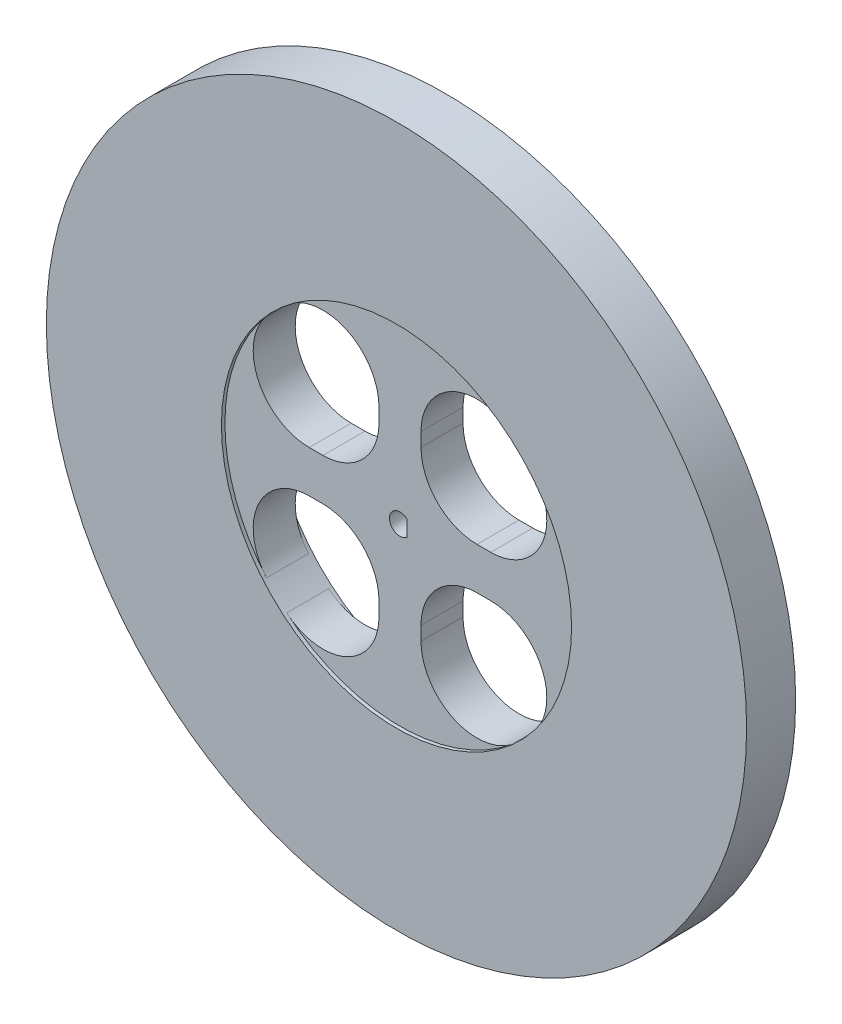
ISO-10303-21;
HEADER;
FILE_DESCRIPTION(('STEP AP214'),'2;1');
FILE_NAME('part.step','',(''),(''),'','','');
FILE_SCHEMA(('AUTOMOTIVE_DESIGN { 1 0 10303 214 1 1 1 1 }'));
ENDSEC;
DATA;
#1=APPLICATION_CONTEXT('core data for automotive mechanical design processes');
#2=APPLICATION_PROTOCOL_DEFINITION('international standard','automotive_design',2000,#1);
#3=PRODUCT_CONTEXT('',#1,'mechanical');
#4=PRODUCT('Part','Part','',(#3));
#5=PRODUCT_RELATED_PRODUCT_CATEGORY('part','',(#4));
#6=PRODUCT_DEFINITION_FORMATION('','',#4);
#7=PRODUCT_DEFINITION_CONTEXT('part definition',#1,'design');
#8=PRODUCT_DEFINITION('design','',#6,#7);
#9=PRODUCT_DEFINITION_SHAPE('','',#8);
#10=(LENGTH_UNIT() NAMED_UNIT(*) SI_UNIT(.MILLI.,.METRE.));
#11=(NAMED_UNIT(*) PLANE_ANGLE_UNIT() SI_UNIT($,.RADIAN.));
#12=(NAMED_UNIT(*) SI_UNIT($,.STERADIAN.) SOLID_ANGLE_UNIT());
#13=UNCERTAINTY_MEASURE_WITH_UNIT(LENGTH_MEASURE(1.E-05),#10,'distance_accuracy_value','');
#14=(GEOMETRIC_REPRESENTATION_CONTEXT(3) GLOBAL_UNCERTAINTY_ASSIGNED_CONTEXT((#13)) GLOBAL_UNIT_ASSIGNED_CONTEXT((#10,
#11,#12)) REPRESENTATION_CONTEXT('',''));
#15=CARTESIAN_POINT('',(0.,0.,0.));
#16=DIRECTION('',(0.,0.,1.));
#17=DIRECTION('',(1.,0.,0.));
#18=AXIS2_PLACEMENT_3D('',#15,#16,#17);
#19=CARTESIAN_POINT('',(0.,0.,-11.6742549493092));
#20=DIRECTION('',(0.,0.,-1.));
#21=DIRECTION('',(-1.,0.,0.));
#22=AXIS2_PLACEMENT_3D('',#19,#20,#21);
#23=CYLINDRICAL_SURFACE('',#22,25.);
#24=CARTESIAN_POINT('',(0.,0.,3.));
#25=DIRECTION('',(0.,0.,1.));
#26=DIRECTION('',(1.,0.,0.));
#27=AXIS2_PLACEMENT_3D('',#24,#25,#26);
#28=CIRCLE('',#27,25.);
#29=CARTESIAN_POINT('',(-19.0610020541408,16.1764705882353,3.));
#30=VERTEX_POINT('',#29);
#31=CARTESIAN_POINT('',(-19.0610020541408,-16.1764705882353,3.));
#32=VERTEX_POINT('',#31);
#33=EDGE_CURVE('E254',#30,#32,#28,.T.);
#34=ORIENTED_EDGE('',*,*,#33,.F.);
#35=DIRECTION('',(0.,0.,-1.));
#36=VECTOR('',#35,1.);
#37=CARTESIAN_POINT('',(-19.0610020541408,16.1764705882353,-11.6742549493092));
#38=LINE('',#37,#36);
#39=CARTESIAN_POINT('',(-19.0610020541408,16.1764705882353,-3.));
#40=VERTEX_POINT('',#39);
#41=EDGE_CURVE('E407',#30,#40,#38,.T.);
#42=ORIENTED_EDGE('',*,*,#41,.T.);
#43=CARTESIAN_POINT('',(0.,0.,-3.));
#44=DIRECTION('',(0.,0.,1.));
#45=DIRECTION('',(1.,0.,0.));
#46=AXIS2_PLACEMENT_3D('',#43,#44,#45);
#47=CIRCLE('',#46,25.);
#48=CARTESIAN_POINT('',(-19.0610020541408,-16.1764705882353,-3.));
#49=VERTEX_POINT('',#48);
#50=EDGE_CURVE('E298',#40,#49,#47,.T.);
#51=ORIENTED_EDGE('',*,*,#50,.T.);
#52=DIRECTION('',(0.,0.,-1.));
#53=VECTOR('',#52,1.);
#54=CARTESIAN_POINT('',(-19.0610020541408,-16.1764705882353,-11.6742549493092));
#55=LINE('',#54,#53);
#56=EDGE_CURVE('E403',#49,#32,#55,.F.);
#57=ORIENTED_EDGE('',*,*,#56,.T.);
#58=EDGE_LOOP('',(#34,#42,#51,#57));
#59=FACE_BOUND('',#58,.T.);
#60=CARTESIAN_POINT('',(0.,0.,3.));
#61=DIRECTION('',(0.,0.,1.));
#62=DIRECTION('',(1.,0.,0.));
#63=AXIS2_PLACEMENT_3D('',#60,#61,#62);
#64=CIRCLE('',#63,25.);
#65=CARTESIAN_POINT('',(19.0610020541408,-16.1764705882353,3.));
#66=VERTEX_POINT('',#65);
#67=CARTESIAN_POINT('',(19.0610020541408,16.1764705882353,3.));
#68=VERTEX_POINT('',#67);
#69=EDGE_CURVE('E276',#66,#68,#64,.T.);
#70=ORIENTED_EDGE('',*,*,#69,.F.);
#71=DIRECTION('',(0.,0.,-1.));
#72=VECTOR('',#71,1.);
#73=CARTESIAN_POINT('',(19.0610020541408,-16.1764705882353,-11.6742549493092));
#74=LINE('',#73,#72);
#75=CARTESIAN_POINT('',(19.0610020541408,-16.1764705882353,-3.));
#76=VERTEX_POINT('',#75);
#77=EDGE_CURVE('E423',#66,#76,#74,.T.);
#78=ORIENTED_EDGE('',*,*,#77,.T.);
#79=CARTESIAN_POINT('',(0.,0.,-3.));
#80=DIRECTION('',(0.,0.,1.));
#81=DIRECTION('',(1.,0.,0.));
#82=AXIS2_PLACEMENT_3D('',#79,#80,#81);
#83=CIRCLE('',#82,25.);
#84=CARTESIAN_POINT('',(19.0610020541408,16.1764705882353,-3.));
#85=VERTEX_POINT('',#84);
#86=EDGE_CURVE('E320',#76,#85,#83,.T.);
#87=ORIENTED_EDGE('',*,*,#86,.T.);
#88=DIRECTION('',(0.,0.,-1.));
#89=VECTOR('',#88,1.);
#90=CARTESIAN_POINT('',(19.0610020541408,16.1764705882353,-11.6742549493092));
#91=LINE('',#90,#89);
#92=EDGE_CURVE('E419',#85,#68,#91,.F.);
#93=ORIENTED_EDGE('',*,*,#92,.T.);
#94=EDGE_LOOP('',(#70,#78,#87,#93));
#95=FACE_BOUND('',#94,.T.);
#96=CARTESIAN_POINT('',(0.,0.,3.5));
#97=DIRECTION('',(0.,0.,-1.));
#98=DIRECTION('',(-1.,0.,0.));
#99=AXIS2_PLACEMENT_3D('',#96,#97,#98);
#100=CIRCLE('',#99,25.);
#101=CARTESIAN_POINT('',(-25.,0.,3.5));
#102=VERTEX_POINT('',#101);
#103=EDGE_CURVE('E339',#102,#102,#100,.T.);
#104=ORIENTED_EDGE('',*,*,#103,.F.);
#105=EDGE_LOOP('',(#104));
#106=FACE_BOUND('',#105,.T.);
#107=CARTESIAN_POINT('',(0.,0.,-3.5));
#108=DIRECTION('',(0.,0.,-1.));
#109=DIRECTION('',(-1.,0.,0.));
#110=AXIS2_PLACEMENT_3D('',#107,#108,#109);
#111=CIRCLE('',#110,25.);
#112=CARTESIAN_POINT('',(-25.,0.,-3.5));
#113=VERTEX_POINT('',#112);
#114=EDGE_CURVE('E335',#113,#113,#111,.T.);
#115=ORIENTED_EDGE('',*,*,#114,.T.);
#116=EDGE_LOOP('',(#115));
#117=FACE_BOUND('',#116,.T.);
#118=DIRECTION('',(0.,0.,-1.));
#119=VECTOR('',#118,1.);
#120=CARTESIAN_POINT('',(-16.1764705882353,19.0610020541408,-11.6742549493092));
#121=LINE('',#120,#119);
#122=CARTESIAN_POINT('',(-16.1764705882353,19.0610020541408,-3.));
#123=VERTEX_POINT('',#122);
#124=CARTESIAN_POINT('',(-16.1764705882353,19.0610020541408,3.));
#125=VERTEX_POINT('',#124);
#126=EDGE_CURVE('E431',#123,#125,#121,.F.);
#127=ORIENTED_EDGE('',*,*,#126,.T.);
#128=CARTESIAN_POINT('',(0.,0.,3.));
#129=DIRECTION('',(0.,0.,1.));
#130=DIRECTION('',(1.,0.,0.));
#131=AXIS2_PLACEMENT_3D('',#128,#129,#130);
#132=CIRCLE('',#131,25.);
#133=CARTESIAN_POINT('',(16.1764705882353,19.0610020541408,3.));
#134=VERTEX_POINT('',#133);
#135=EDGE_CURVE('E230',#134,#125,#132,.T.);
#136=ORIENTED_EDGE('',*,*,#135,.F.);
#137=DIRECTION('',(0.,0.,-1.));
#138=VECTOR('',#137,1.);
#139=CARTESIAN_POINT('',(16.1764705882353,19.0610020541408,-11.6742549493092));
#140=LINE('',#139,#138);
#141=CARTESIAN_POINT('',(16.1764705882353,19.0610020541408,-3.));
#142=VERTEX_POINT('',#141);
#143=EDGE_CURVE('E427',#134,#142,#140,.T.);
#144=ORIENTED_EDGE('',*,*,#143,.T.);
#145=CARTESIAN_POINT('',(0.,0.,-3.));
#146=DIRECTION('',(0.,0.,1.));
#147=DIRECTION('',(1.,0.,0.));
#148=AXIS2_PLACEMENT_3D('',#145,#146,#147);
#149=CIRCLE('',#148,25.);
#150=EDGE_CURVE('E287',#142,#123,#149,.T.);
#151=ORIENTED_EDGE('',*,*,#150,.T.);
#152=EDGE_LOOP('',(#127,#136,#144,#151));
#153=FACE_BOUND('',#152,.T.);
#154=CARTESIAN_POINT('',(0.,0.,3.));
#155=DIRECTION('',(0.,0.,1.));
#156=DIRECTION('',(1.,0.,0.));
#157=AXIS2_PLACEMENT_3D('',#154,#155,#156);
#158=CIRCLE('',#157,25.);
#159=CARTESIAN_POINT('',(-16.1764705882353,-19.0610020541408,3.));
#160=VERTEX_POINT('',#159);
#161=CARTESIAN_POINT('',(16.1764705882353,-19.0610020541408,3.));
#162=VERTEX_POINT('',#161);
#163=EDGE_CURVE('E265',#160,#162,#158,.T.);
#164=ORIENTED_EDGE('',*,*,#163,.F.);
#165=DIRECTION('',(0.,0.,-1.));
#166=VECTOR('',#165,1.);
#167=CARTESIAN_POINT('',(-16.1764705882353,-19.0610020541408,-11.6742549493092));
#168=LINE('',#167,#166);
#169=CARTESIAN_POINT('',(-16.1764705882353,-19.0610020541408,-3.));
#170=VERTEX_POINT('',#169);
#171=EDGE_CURVE('E415',#160,#170,#168,.T.);
#172=ORIENTED_EDGE('',*,*,#171,.T.);
#173=CARTESIAN_POINT('',(0.,0.,-3.));
#174=DIRECTION('',(0.,0.,1.));
#175=DIRECTION('',(1.,0.,0.));
#176=AXIS2_PLACEMENT_3D('',#173,#174,#175);
#177=CIRCLE('',#176,25.);
#178=CARTESIAN_POINT('',(16.1764705882353,-19.0610020541408,-3.));
#179=VERTEX_POINT('',#178);
#180=EDGE_CURVE('E309',#170,#179,#177,.T.);
#181=ORIENTED_EDGE('',*,*,#180,.T.);
#182=DIRECTION('',(0.,0.,-1.));
#183=VECTOR('',#182,1.);
#184=CARTESIAN_POINT('',(16.1764705882353,-19.0610020541408,-11.6742549493092));
#185=LINE('',#184,#183);
#186=EDGE_CURVE('E411',#179,#162,#185,.F.);
#187=ORIENTED_EDGE('',*,*,#186,.T.);
#188=EDGE_LOOP('',(#164,#172,#181,#187));
#189=FACE_BOUND('',#188,.T.);
#190=ADVANCED_FACE('F45',(#59,#95,#106,#117,#153,#189),#23,.F.);
#191=CARTESIAN_POINT('',(0.,0.,-11.6742549493092));
#192=DIRECTION('',(0.,0.,-1.));
#193=DIRECTION('',(-1.,0.,0.));
#194=AXIS2_PLACEMENT_3D('',#191,#192,#193);
#195=CYLINDRICAL_SURFACE('',#194,50.);
#196=CARTESIAN_POINT('',(0.,0.,-3.5));
#197=DIRECTION('',(0.,0.,-1.));
#198=DIRECTION('',(-1.,0.,0.));
#199=AXIS2_PLACEMENT_3D('',#196,#197,#198);
#200=CIRCLE('',#199,50.);
#201=CARTESIAN_POINT('',(-50.,0.,-3.5));
#202=VERTEX_POINT('',#201);
#203=EDGE_CURVE('E331',#202,#202,#200,.T.);
#204=ORIENTED_EDGE('',*,*,#203,.F.);
#205=EDGE_LOOP('',(#204));
#206=FACE_BOUND('',#205,.T.);
#207=CARTESIAN_POINT('',(0.,0.,3.5));
#208=DIRECTION('',(0.,0.,-1.));
#209=DIRECTION('',(-1.,0.,0.));
#210=AXIS2_PLACEMENT_3D('',#207,#208,#209);
#211=CIRCLE('',#210,50.);
#212=CARTESIAN_POINT('',(-50.,0.,3.5));
#213=VERTEX_POINT('',#212);
#214=EDGE_CURVE('E343',#213,#213,#211,.T.);
#215=ORIENTED_EDGE('',*,*,#214,.T.);
#216=EDGE_LOOP('',(#215));
#217=FACE_BOUND('',#216,.T.);
#218=ADVANCED_FACE('F612',(#206,#217),#195,.T.);
#219=CARTESIAN_POINT('',(25.,0.,3.5));
#220=DIRECTION('',(0.,0.,-1.));
#221=DIRECTION('',(-1.,0.,0.));
#222=AXIS2_PLACEMENT_3D('',#219,#220,#221);
#223=PLANE('',#222);
#224=ORIENTED_EDGE('',*,*,#214,.F.);
#225=EDGE_LOOP('',(#224));
#226=FACE_BOUND('',#225,.T.);
#227=ORIENTED_EDGE('',*,*,#103,.T.);
#228=EDGE_LOOP('',(#227));
#229=FACE_BOUND('',#228,.T.);
#230=ADVANCED_FACE('F619',(#226,#229),#223,.F.);
#231=CARTESIAN_POINT('',(25.,0.,-3.5));
#232=DIRECTION('',(0.,0.,1.));
#233=DIRECTION('',(1.,0.,0.));
#234=AXIS2_PLACEMENT_3D('',#231,#232,#233);
#235=PLANE('',#234);
#236=ORIENTED_EDGE('',*,*,#114,.F.);
#237=EDGE_LOOP('',(#236));
#238=FACE_BOUND('',#237,.T.);
#239=ORIENTED_EDGE('',*,*,#203,.T.);
#240=EDGE_LOOP('',(#239));
#241=FACE_BOUND('',#240,.T.);
#242=ADVANCED_FACE('F624',(#238,#241),#235,.F.);
#243=CARTESIAN_POINT('',(3.00000000000001,24.8193472919817,-3.));
#244=DIRECTION('',(1.,0.,0.));
#245=DIRECTION('',(0.,1.,0.));
#246=AXIS2_PLACEMENT_3D('',#243,#244,#245);
#247=PLANE('',#246);
#248=DIRECTION('',(0.,1.,0.));
#249=VECTOR('',#248,1.);
#250=CARTESIAN_POINT('',(3.00000000000001,24.8193472919817,3.));
#251=LINE('',#250,#249);
#252=CARTESIAN_POINT('',(3.,11.,3.));
#253=VERTEX_POINT('',#252);
#254=CARTESIAN_POINT('',(3.,12.9614813968157,3.));
#255=VERTEX_POINT('',#254);
#256=EDGE_CURVE('E283',#253,#255,#251,.T.);
#257=ORIENTED_EDGE('',*,*,#256,.F.);
#258=DIRECTION('',(0.,0.,1.));
#259=VECTOR('',#258,1.);
#260=CARTESIAN_POINT('',(3.,11.,-3.));
#261=LINE('',#260,#259);
#262=CARTESIAN_POINT('',(3.,11.,-3.));
#263=VERTEX_POINT('',#262);
#264=EDGE_CURVE('E400',#253,#263,#261,.F.);
#265=ORIENTED_EDGE('',*,*,#264,.T.);
#266=DIRECTION('',(0.,1.,0.));
#267=VECTOR('',#266,1.);
#268=CARTESIAN_POINT('',(3.00000000000001,24.8193472919817,-3.));
#269=LINE('',#268,#267);
#270=CARTESIAN_POINT('',(3.,12.9614813968157,-3.));
#271=VERTEX_POINT('',#270);
#272=EDGE_CURVE('E327',#263,#271,#269,.T.);
#273=ORIENTED_EDGE('',*,*,#272,.T.);
#274=DIRECTION('',(0.,0.,-1.));
#275=VECTOR('',#274,1.);
#276=CARTESIAN_POINT('',(3.,12.9614813968157,-3.));
#277=LINE('',#276,#275);
#278=EDGE_CURVE('E396',#271,#255,#277,.F.);
#279=ORIENTED_EDGE('',*,*,#278,.T.);
#280=EDGE_LOOP('',(#257,#265,#273,#279));
#281=FACE_BOUND('',#280,.T.);
#282=ADVANCED_FACE('F579',(#281),#247,.T.);
#283=CARTESIAN_POINT('',(3.,3.,-3.));
#284=DIRECTION('',(0.,1.,0.));
#285=DIRECTION('',(-1.,0.,0.));
#286=AXIS2_PLACEMENT_3D('',#283,#284,#285);
#287=PLANE('',#286);
#288=DIRECTION('',(-1.,0.,0.));
#289=VECTOR('',#288,1.);
#290=CARTESIAN_POINT('',(3.,3.,-3.));
#291=LINE('',#290,#289);
#292=CARTESIAN_POINT('',(12.9614813968157,3.,-3.));
#293=VERTEX_POINT('',#292);
#294=CARTESIAN_POINT('',(11.,3.,-3.));
#295=VERTEX_POINT('',#294);
#296=EDGE_CURVE('E323',#293,#295,#291,.T.);
#297=ORIENTED_EDGE('',*,*,#296,.T.);
#298=DIRECTION('',(0.,0.,1.));
#299=VECTOR('',#298,1.);
#300=CARTESIAN_POINT('',(11.,3.,3.));
#301=LINE('',#300,#299);
#302=CARTESIAN_POINT('',(11.,3.,3.));
#303=VERTEX_POINT('',#302);
#304=EDGE_CURVE('E392',#295,#303,#301,.T.);
#305=ORIENTED_EDGE('',*,*,#304,.T.);
#306=DIRECTION('',(-1.,0.,0.));
#307=VECTOR('',#306,1.);
#308=CARTESIAN_POINT('',(3.,3.,3.));
#309=LINE('',#308,#307);
#310=CARTESIAN_POINT('',(12.9614813968157,3.,3.));
#311=VERTEX_POINT('',#310);
#312=EDGE_CURVE('E279',#311,#303,#309,.T.);
#313=ORIENTED_EDGE('',*,*,#312,.F.);
#314=DIRECTION('',(0.,0.,-1.));
#315=VECTOR('',#314,1.);
#316=CARTESIAN_POINT('',(12.9614813968157,3.,-3.));
#317=LINE('',#316,#315);
#318=EDGE_CURVE('E389',#311,#293,#317,.T.);
#319=ORIENTED_EDGE('',*,*,#318,.T.);
#320=EDGE_LOOP('',(#297,#305,#313,#319));
#321=FACE_BOUND('',#320,.T.);
#322=ADVANCED_FACE('F573',(#321),#287,.T.);
#323=CARTESIAN_POINT('',(3.,-3.,-3.));
#324=DIRECTION('',(0.,-1.,0.));
#325=DIRECTION('',(1.,0.,0.));
#326=AXIS2_PLACEMENT_3D('',#323,#324,#325);
#327=PLANE('',#326);
#328=DIRECTION('',(1.,0.,0.));
#329=VECTOR('',#328,1.);
#330=CARTESIAN_POINT('',(3.,-3.,3.));
#331=LINE('',#330,#329);
#332=CARTESIAN_POINT('',(11.,-3.,3.));
#333=VERTEX_POINT('',#332);
#334=CARTESIAN_POINT('',(12.9614813968157,-3.,3.));
#335=VERTEX_POINT('',#334);
#336=EDGE_CURVE('E272',#333,#335,#331,.T.);
#337=ORIENTED_EDGE('',*,*,#336,.F.);
#338=DIRECTION('',(0.,0.,1.));
#339=VECTOR('',#338,1.);
#340=CARTESIAN_POINT('',(11.,-3.,-3.));
#341=LINE('',#340,#339);
#342=CARTESIAN_POINT('',(11.,-3.,-3.));
#343=VERTEX_POINT('',#342);
#344=EDGE_CURVE('E358',#333,#343,#341,.F.);
#345=ORIENTED_EDGE('',*,*,#344,.T.);
#346=DIRECTION('',(1.,0.,0.));
#347=VECTOR('',#346,1.);
#348=CARTESIAN_POINT('',(3.,-3.,-3.));
#349=LINE('',#348,#347);
#350=CARTESIAN_POINT('',(12.9614813968157,-3.,-3.));
#351=VERTEX_POINT('',#350);
#352=EDGE_CURVE('E316',#343,#351,#349,.T.);
#353=ORIENTED_EDGE('',*,*,#352,.T.);
#354=DIRECTION('',(0.,0.,-1.));
#355=VECTOR('',#354,1.);
#356=CARTESIAN_POINT('',(12.9614813968157,-3.,-3.));
#357=LINE('',#356,#355);
#358=EDGE_CURVE('E354',#351,#335,#357,.F.);
#359=ORIENTED_EDGE('',*,*,#358,.T.);
#360=EDGE_LOOP('',(#337,#345,#353,#359));
#361=FACE_BOUND('',#360,.T.);
#362=ADVANCED_FACE('F553',(#361),#327,.T.);
#363=CARTESIAN_POINT('',(3.,-3.,-3.));
#364=DIRECTION('',(1.,0.,0.));
#365=DIRECTION('',(0.,1.,0.));
#366=AXIS2_PLACEMENT_3D('',#363,#364,#365);
#367=PLANE('',#366);
#368=DIRECTION('',(0.,1.,0.));
#369=VECTOR('',#368,1.);
#370=CARTESIAN_POINT('',(3.,-3.,-3.));
#371=LINE('',#370,#369);
#372=CARTESIAN_POINT('',(3.,-12.9614813968157,-3.));
#373=VERTEX_POINT('',#372);
#374=CARTESIAN_POINT('',(3.,-11.,-3.));
#375=VERTEX_POINT('',#374);
#376=EDGE_CURVE('E312',#373,#375,#371,.T.);
#377=ORIENTED_EDGE('',*,*,#376,.T.);
#378=DIRECTION('',(0.,0.,1.));
#379=VECTOR('',#378,1.);
#380=CARTESIAN_POINT('',(3.,-11.,3.));
#381=LINE('',#380,#379);
#382=CARTESIAN_POINT('',(3.,-11.,3.));
#383=VERTEX_POINT('',#382);
#384=EDGE_CURVE('E350',#375,#383,#381,.T.);
#385=ORIENTED_EDGE('',*,*,#384,.T.);
#386=DIRECTION('',(0.,1.,0.));
#387=VECTOR('',#386,1.);
#388=CARTESIAN_POINT('',(3.,-3.,3.));
#389=LINE('',#388,#387);
#390=CARTESIAN_POINT('',(3.,-12.9614813968157,3.));
#391=VERTEX_POINT('',#390);
#392=EDGE_CURVE('E268',#391,#383,#389,.T.);
#393=ORIENTED_EDGE('',*,*,#392,.F.);
#394=DIRECTION('',(0.,0.,-1.));
#395=VECTOR('',#394,1.);
#396=CARTESIAN_POINT('',(3.,-12.9614813968157,-3.));
#397=LINE('',#396,#395);
#398=EDGE_CURVE('E347',#391,#373,#397,.T.);
#399=ORIENTED_EDGE('',*,*,#398,.T.);
#400=EDGE_LOOP('',(#377,#385,#393,#399));
#401=FACE_BOUND('',#400,.T.);
#402=ADVANCED_FACE('F547',(#401),#367,.T.);
#403=CARTESIAN_POINT('',(-3.,-3.,-3.));
#404=DIRECTION('',(-1.,0.,0.));
#405=DIRECTION('',(0.,-1.,0.));
#406=AXIS2_PLACEMENT_3D('',#403,#404,#405);
#407=PLANE('',#406);
#408=DIRECTION('',(0.,-1.,0.));
#409=VECTOR('',#408,1.);
#410=CARTESIAN_POINT('',(-3.,-3.,3.));
#411=LINE('',#410,#409);
#412=CARTESIAN_POINT('',(-3.,-11.,3.));
#413=VERTEX_POINT('',#412);
#414=CARTESIAN_POINT('',(-3.,-12.9614813968157,3.));
#415=VERTEX_POINT('',#414);
#416=EDGE_CURVE('E261',#413,#415,#411,.T.);
#417=ORIENTED_EDGE('',*,*,#416,.F.);
#418=DIRECTION('',(0.,0.,1.));
#419=VECTOR('',#418,1.);
#420=CARTESIAN_POINT('',(-3.,-11.,-3.));
#421=LINE('',#420,#419);
#422=CARTESIAN_POINT('',(-3.,-11.,-3.));
#423=VERTEX_POINT('',#422);
#424=EDGE_CURVE('E372',#413,#423,#421,.F.);
#425=ORIENTED_EDGE('',*,*,#424,.T.);
#426=DIRECTION('',(0.,-1.,0.));
#427=VECTOR('',#426,1.);
#428=CARTESIAN_POINT('',(-3.,-3.,-3.));
#429=LINE('',#428,#427);
#430=CARTESIAN_POINT('',(-3.,-12.9614813968157,-3.));
#431=VERTEX_POINT('',#430);
#432=EDGE_CURVE('E305',#423,#431,#429,.T.);
#433=ORIENTED_EDGE('',*,*,#432,.T.);
#434=DIRECTION('',(0.,0.,-1.));
#435=VECTOR('',#434,1.);
#436=CARTESIAN_POINT('',(-3.,-12.9614813968157,-3.));
#437=LINE('',#436,#435);
#438=EDGE_CURVE('E368',#431,#415,#437,.F.);
#439=ORIENTED_EDGE('',*,*,#438,.T.);
#440=EDGE_LOOP('',(#417,#425,#433,#439));
#441=FACE_BOUND('',#440,.T.);
#442=ADVANCED_FACE('F528',(#441),#407,.T.);
#443=CARTESIAN_POINT('',(-24.8193472919817,-3.,-3.));
#444=DIRECTION('',(0.,-1.,0.));
#445=DIRECTION('',(1.,0.,0.));
#446=AXIS2_PLACEMENT_3D('',#443,#444,#445);
#447=PLANE('',#446);
#448=DIRECTION('',(1.,0.,0.));
#449=VECTOR('',#448,1.);
#450=CARTESIAN_POINT('',(-24.8193472919817,-3.,-3.));
#451=LINE('',#450,#449);
#452=CARTESIAN_POINT('',(-12.9614813968157,-3.,-3.));
#453=VERTEX_POINT('',#452);
#454=CARTESIAN_POINT('',(-11.,-3.,-3.));
#455=VERTEX_POINT('',#454);
#456=EDGE_CURVE('E301',#453,#455,#451,.T.);
#457=ORIENTED_EDGE('',*,*,#456,.T.);
#458=DIRECTION('',(0.,0.,1.));
#459=VECTOR('',#458,1.);
#460=CARTESIAN_POINT('',(-11.,-3.,3.));
#461=LINE('',#460,#459);
#462=CARTESIAN_POINT('',(-11.,-3.,3.));
#463=VERTEX_POINT('',#462);
#464=EDGE_CURVE('E364',#455,#463,#461,.T.);
#465=ORIENTED_EDGE('',*,*,#464,.T.);
#466=DIRECTION('',(1.,0.,0.));
#467=VECTOR('',#466,1.);
#468=CARTESIAN_POINT('',(-24.8193472919817,-3.,3.));
#469=LINE('',#468,#467);
#470=CARTESIAN_POINT('',(-12.9614813968157,-3.,3.));
#471=VERTEX_POINT('',#470);
#472=EDGE_CURVE('E257',#471,#463,#469,.T.);
#473=ORIENTED_EDGE('',*,*,#472,.F.);
#474=DIRECTION('',(0.,0.,-1.));
#475=VECTOR('',#474,1.);
#476=CARTESIAN_POINT('',(-12.9614813968157,-3.,-3.));
#477=LINE('',#476,#475);
#478=EDGE_CURVE('E361',#471,#453,#477,.T.);
#479=ORIENTED_EDGE('',*,*,#478,.T.);
#480=EDGE_LOOP('',(#457,#465,#473,#479));
#481=FACE_BOUND('',#480,.T.);
#482=ADVANCED_FACE('F517',(#481),#447,.T.);
#483=CARTESIAN_POINT('',(-24.8193472919817,3.,-3.));
#484=DIRECTION('',(0.,1.,0.));
#485=DIRECTION('',(-1.,0.,0.));
#486=AXIS2_PLACEMENT_3D('',#483,#484,#485);
#487=PLANE('',#486);
#488=DIRECTION('',(-1.,0.,0.));
#489=VECTOR('',#488,1.);
#490=CARTESIAN_POINT('',(-24.8193472919817,3.,3.));
#491=LINE('',#490,#489);
#492=CARTESIAN_POINT('',(-11.,3.,3.));
#493=VERTEX_POINT('',#492);
#494=CARTESIAN_POINT('',(-12.9614813968157,3.,3.));
#495=VERTEX_POINT('',#494);
#496=EDGE_CURVE('E250',#493,#495,#491,.T.);
#497=ORIENTED_EDGE('',*,*,#496,.F.);
#498=DIRECTION('',(0.,0.,1.));
#499=VECTOR('',#498,1.);
#500=CARTESIAN_POINT('',(-11.,3.,-3.));
#501=LINE('',#500,#499);
#502=CARTESIAN_POINT('',(-11.,3.,-3.));
#503=VERTEX_POINT('',#502);
#504=EDGE_CURVE('E386',#493,#503,#501,.F.);
#505=ORIENTED_EDGE('',*,*,#504,.T.);
#506=DIRECTION('',(-1.,0.,0.));
#507=VECTOR('',#506,1.);
#508=CARTESIAN_POINT('',(-24.8193472919817,3.,-3.));
#509=LINE('',#508,#507);
#510=CARTESIAN_POINT('',(-12.9614813968157,3.,-3.));
#511=VERTEX_POINT('',#510);
#512=EDGE_CURVE('E294',#503,#511,#509,.T.);
#513=ORIENTED_EDGE('',*,*,#512,.T.);
#514=DIRECTION('',(0.,0.,-1.));
#515=VECTOR('',#514,1.);
#516=CARTESIAN_POINT('',(-12.9614813968157,3.,-3.));
#517=LINE('',#516,#515);
#518=EDGE_CURVE('E382',#511,#495,#517,.F.);
#519=ORIENTED_EDGE('',*,*,#518,.T.);
#520=EDGE_LOOP('',(#497,#505,#513,#519));
#521=FACE_BOUND('',#520,.T.);
#522=ADVANCED_FACE('F604',(#521),#487,.T.);
#523=CARTESIAN_POINT('',(-2.99999999999999,24.8193472919817,-3.));
#524=DIRECTION('',(-1.,0.,0.));
#525=DIRECTION('',(0.,-1.,0.));
#526=AXIS2_PLACEMENT_3D('',#523,#524,#525);
#527=PLANE('',#526);
#528=DIRECTION('',(0.,-1.,0.));
#529=VECTOR('',#528,1.);
#530=CARTESIAN_POINT('',(-2.99999999999999,24.8193472919817,-3.));
#531=LINE('',#530,#529);
#532=CARTESIAN_POINT('',(-3.,12.9614813968157,-3.));
#533=VERTEX_POINT('',#532);
#534=CARTESIAN_POINT('',(-3.,11.,-3.));
#535=VERTEX_POINT('',#534);
#536=EDGE_CURVE('E290',#533,#535,#531,.T.);
#537=ORIENTED_EDGE('',*,*,#536,.T.);
#538=DIRECTION('',(0.,0.,1.));
#539=VECTOR('',#538,1.);
#540=CARTESIAN_POINT('',(-3.,11.,3.));
#541=LINE('',#540,#539);
#542=CARTESIAN_POINT('',(-3.,11.,3.));
#543=VERTEX_POINT('',#542);
#544=EDGE_CURVE('E378',#535,#543,#541,.T.);
#545=ORIENTED_EDGE('',*,*,#544,.T.);
#546=DIRECTION('',(0.,-1.,0.));
#547=VECTOR('',#546,1.);
#548=CARTESIAN_POINT('',(-2.99999999999999,24.8193472919817,3.));
#549=LINE('',#548,#547);
#550=CARTESIAN_POINT('',(-3.,12.9614813968157,3.));
#551=VERTEX_POINT('',#550);
#552=EDGE_CURVE('E246',#551,#543,#549,.T.);
#553=ORIENTED_EDGE('',*,*,#552,.F.);
#554=DIRECTION('',(0.,0.,-1.));
#555=VECTOR('',#554,1.);
#556=CARTESIAN_POINT('',(-3.,12.9614813968157,-3.));
#557=LINE('',#556,#555);
#558=EDGE_CURVE('E375',#551,#533,#557,.T.);
#559=ORIENTED_EDGE('',*,*,#558,.T.);
#560=EDGE_LOOP('',(#537,#545,#553,#559));
#561=FACE_BOUND('',#560,.T.);
#562=ADVANCED_FACE('F598',(#561),#527,.T.);
#563=CARTESIAN_POINT('',(0.,0.,-3.));
#564=DIRECTION('',(0.,0.,1.));
#565=DIRECTION('',(1.,0.,0.));
#566=AXIS2_PLACEMENT_3D('',#563,#564,#565);
#567=PLANE('',#566);
#568=DIRECTION('',(0.,-1.,0.));
#569=VECTOR('',#568,1.);
#570=CARTESIAN_POINT('',(1.,1.11803398874989,-3.));
#571=LINE('',#570,#569);
#572=CARTESIAN_POINT('',(1.,1.11803398874989,-3.));
#573=VERTEX_POINT('',#572);
#574=CARTESIAN_POINT('',(1.,-1.11803398874989,-3.));
#575=VERTEX_POINT('',#574);
#576=EDGE_CURVE('E226',#573,#575,#571,.T.);
#577=ORIENTED_EDGE('',*,*,#576,.F.);
#578=CARTESIAN_POINT('',(0.,0.,-3.));
#579=DIRECTION('',(0.,0.,1.));
#580=DIRECTION('',(1.,0.,0.));
#581=AXIS2_PLACEMENT_3D('',#578,#579,#580);
#582=CIRCLE('',#581,1.5);
#583=EDGE_CURVE('E61',#575,#573,#582,.F.);
#584=ORIENTED_EDGE('',*,*,#583,.F.);
#585=EDGE_LOOP('',(#577,#584));
#586=FACE_BOUND('',#585,.T.);
#587=ORIENTED_EDGE('',*,*,#150,.F.);
#588=CARTESIAN_POINT('',(11.,12.9614813968157,-3.));
#589=DIRECTION('',(0.,0.,1.));
#590=DIRECTION('',(1.,0.,0.));
#591=AXIS2_PLACEMENT_3D('',#588,#589,#590);
#592=CIRCLE('',#591,8.);
#593=EDGE_CURVE('E470',#142,#271,#592,.T.);
#594=ORIENTED_EDGE('',*,*,#593,.T.);
#595=ORIENTED_EDGE('',*,*,#272,.F.);
#596=CARTESIAN_POINT('',(11.,11.,-3.));
#597=DIRECTION('',(0.,0.,1.));
#598=DIRECTION('',(1.,0.,0.));
#599=AXIS2_PLACEMENT_3D('',#596,#597,#598);
#600=CIRCLE('',#599,8.);
#601=EDGE_CURVE('E456',#263,#295,#600,.T.);
#602=ORIENTED_EDGE('',*,*,#601,.T.);
#603=ORIENTED_EDGE('',*,*,#296,.F.);
#604=CARTESIAN_POINT('',(12.9614813968157,11.,-3.));
#605=DIRECTION('',(0.,0.,1.));
#606=DIRECTION('',(1.,0.,0.));
#607=AXIS2_PLACEMENT_3D('',#604,#605,#606);
#608=CIRCLE('',#607,8.);
#609=EDGE_CURVE('E483',#293,#85,#608,.T.);
#610=ORIENTED_EDGE('',*,*,#609,.T.);
#611=ORIENTED_EDGE('',*,*,#86,.F.);
#612=CARTESIAN_POINT('',(12.9614813968157,-11.,-3.));
#613=DIRECTION('',(0.,0.,1.));
#614=DIRECTION('',(1.,0.,0.));
#615=AXIS2_PLACEMENT_3D('',#612,#613,#614);
#616=CIRCLE('',#615,8.);
#617=EDGE_CURVE('E477',#76,#351,#616,.T.);
#618=ORIENTED_EDGE('',*,*,#617,.T.);
#619=ORIENTED_EDGE('',*,*,#352,.F.);
#620=CARTESIAN_POINT('',(11.,-11.,-3.));
#621=DIRECTION('',(0.,0.,1.));
#622=DIRECTION('',(1.,0.,0.));
#623=AXIS2_PLACEMENT_3D('',#620,#621,#622);
#624=CIRCLE('',#623,8.);
#625=EDGE_CURVE('E438',#343,#375,#624,.T.);
#626=ORIENTED_EDGE('',*,*,#625,.T.);
#627=ORIENTED_EDGE('',*,*,#376,.F.);
#628=CARTESIAN_POINT('',(11.,-12.9614813968157,-3.));
#629=DIRECTION('',(0.,0.,1.));
#630=DIRECTION('',(1.,0.,0.));
#631=AXIS2_PLACEMENT_3D('',#628,#629,#630);
#632=CIRCLE('',#631,8.);
#633=EDGE_CURVE('E497',#373,#179,#632,.T.);
#634=ORIENTED_EDGE('',*,*,#633,.T.);
#635=ORIENTED_EDGE('',*,*,#180,.F.);
#636=CARTESIAN_POINT('',(-11.,-12.9614813968157,-3.));
#637=DIRECTION('',(0.,0.,1.));
#638=DIRECTION('',(1.,0.,0.));
#639=AXIS2_PLACEMENT_3D('',#636,#637,#638);
#640=CIRCLE('',#639,8.);
#641=EDGE_CURVE('E491',#170,#431,#640,.T.);
#642=ORIENTED_EDGE('',*,*,#641,.T.);
#643=ORIENTED_EDGE('',*,*,#432,.F.);
#644=CARTESIAN_POINT('',(-11.,-11.,-3.));
#645=DIRECTION('',(0.,0.,1.));
#646=DIRECTION('',(1.,0.,0.));
#647=AXIS2_PLACEMENT_3D('',#644,#645,#646);
#648=CIRCLE('',#647,8.);
#649=EDGE_CURVE('E444',#423,#455,#648,.T.);
#650=ORIENTED_EDGE('',*,*,#649,.T.);
#651=ORIENTED_EDGE('',*,*,#456,.F.);
#652=CARTESIAN_POINT('',(-12.9614813968157,-11.,-3.));
#653=DIRECTION('',(0.,0.,1.));
#654=DIRECTION('',(1.,0.,0.));
#655=AXIS2_PLACEMENT_3D('',#652,#653,#654);
#656=CIRCLE('',#655,8.);
#657=EDGE_CURVE('E11',#453,#49,#656,.T.);
#658=ORIENTED_EDGE('',*,*,#657,.T.);
#659=ORIENTED_EDGE('',*,*,#50,.F.);
#660=CARTESIAN_POINT('',(-12.9614813968157,11.,-3.));
#661=DIRECTION('',(0.,0.,1.));
#662=DIRECTION('',(1.,0.,0.));
#663=AXIS2_PLACEMENT_3D('',#660,#661,#662);
#664=CIRCLE('',#663,8.);
#665=EDGE_CURVE('E505',#40,#511,#664,.T.);
#666=ORIENTED_EDGE('',*,*,#665,.T.);
#667=ORIENTED_EDGE('',*,*,#512,.F.);
#668=CARTESIAN_POINT('',(-11.,11.,-3.));
#669=DIRECTION('',(0.,0.,1.));
#670=DIRECTION('',(1.,0.,0.));
#671=AXIS2_PLACEMENT_3D('',#668,#669,#670);
#672=CIRCLE('',#671,8.);
#673=EDGE_CURVE('E450',#503,#535,#672,.T.);
#674=ORIENTED_EDGE('',*,*,#673,.T.);
#675=ORIENTED_EDGE('',*,*,#536,.F.);
#676=CARTESIAN_POINT('',(-11.,12.9614813968157,-3.));
#677=DIRECTION('',(0.,0.,1.));
#678=DIRECTION('',(1.,0.,0.));
#679=AXIS2_PLACEMENT_3D('',#676,#677,#678);
#680=CIRCLE('',#679,8.);
#681=EDGE_CURVE('E462',#533,#123,#680,.T.);
#682=ORIENTED_EDGE('',*,*,#681,.T.);
#683=EDGE_LOOP('',(#587,#594,#595,#602,#603,#610,#611,#618,#619,#626,#627,#634,#635,#642,#643,
#650,#651,#658,#659,#666,#667,#674,#675,#682));
#684=FACE_BOUND('',#683,.T.);
#685=ADVANCED_FACE('F232',(#586,#684),#567,.F.);
#686=CARTESIAN_POINT('',(0.,0.,3.));
#687=DIRECTION('',(0.,0.,1.));
#688=DIRECTION('',(1.,0.,0.));
#689=AXIS2_PLACEMENT_3D('',#686,#687,#688);
#690=PLANE('',#689);
#691=CARTESIAN_POINT('',(0.,0.,3.));
#692=DIRECTION('',(0.,0.,1.));
#693=DIRECTION('',(1.,0.,0.));
#694=AXIS2_PLACEMENT_3D('',#691,#692,#693);
#695=CIRCLE('',#694,1.5);
#696=CARTESIAN_POINT('',(1.,1.11803398874989,3.));
#697=VERTEX_POINT('',#696);
#698=CARTESIAN_POINT('',(1.,-1.11803398874989,3.));
#699=VERTEX_POINT('',#698);
#700=EDGE_CURVE('E66',#697,#699,#695,.T.);
#701=ORIENTED_EDGE('',*,*,#700,.F.);
#702=DIRECTION('',(0.,1.,0.));
#703=VECTOR('',#702,1.);
#704=CARTESIAN_POINT('',(1.,1.11803398874989,3.));
#705=LINE('',#704,#703);
#706=EDGE_CURVE('E223',#699,#697,#705,.T.);
#707=ORIENTED_EDGE('',*,*,#706,.F.);
#708=EDGE_LOOP('',(#701,#707));
#709=FACE_BOUND('',#708,.T.);
#710=ORIENTED_EDGE('',*,*,#135,.T.);
#711=CARTESIAN_POINT('',(-11.,12.9614813968157,3.));
#712=DIRECTION('',(0.,0.,1.));
#713=DIRECTION('',(1.,0.,0.));
#714=AXIS2_PLACEMENT_3D('',#711,#712,#713);
#715=CIRCLE('',#714,8.);
#716=EDGE_CURVE('E459',#125,#551,#715,.F.);
#717=ORIENTED_EDGE('',*,*,#716,.T.);
#718=ORIENTED_EDGE('',*,*,#552,.T.);
#719=CARTESIAN_POINT('',(-11.,11.,3.));
#720=DIRECTION('',(0.,0.,1.));
#721=DIRECTION('',(1.,0.,0.));
#722=AXIS2_PLACEMENT_3D('',#719,#720,#721);
#723=CIRCLE('',#722,8.);
#724=EDGE_CURVE('E447',#543,#493,#723,.F.);
#725=ORIENTED_EDGE('',*,*,#724,.T.);
#726=ORIENTED_EDGE('',*,*,#496,.T.);
#727=CARTESIAN_POINT('',(-12.9614813968157,11.,3.));
#728=DIRECTION('',(0.,0.,1.));
#729=DIRECTION('',(1.,0.,0.));
#730=AXIS2_PLACEMENT_3D('',#727,#728,#729);
#731=CIRCLE('',#730,8.);
#732=EDGE_CURVE('E501',#495,#30,#731,.F.);
#733=ORIENTED_EDGE('',*,*,#732,.T.);
#734=ORIENTED_EDGE('',*,*,#33,.T.);
#735=CARTESIAN_POINT('',(-12.9614813968157,-11.,3.));
#736=DIRECTION('',(0.,0.,1.));
#737=DIRECTION('',(1.,0.,0.));
#738=AXIS2_PLACEMENT_3D('',#735,#736,#737);
#739=CIRCLE('',#738,8.);
#740=EDGE_CURVE('E54',#32,#471,#739,.F.);
#741=ORIENTED_EDGE('',*,*,#740,.T.);
#742=ORIENTED_EDGE('',*,*,#472,.T.);
#743=CARTESIAN_POINT('',(-11.,-11.,3.));
#744=DIRECTION('',(0.,0.,1.));
#745=DIRECTION('',(1.,0.,0.));
#746=AXIS2_PLACEMENT_3D('',#743,#744,#745);
#747=CIRCLE('',#746,8.);
#748=EDGE_CURVE('E441',#463,#413,#747,.F.);
#749=ORIENTED_EDGE('',*,*,#748,.T.);
#750=ORIENTED_EDGE('',*,*,#416,.T.);
#751=CARTESIAN_POINT('',(-11.,-12.9614813968157,3.));
#752=DIRECTION('',(0.,0.,1.));
#753=DIRECTION('',(1.,0.,0.));
#754=AXIS2_PLACEMENT_3D('',#751,#752,#753);
#755=CIRCLE('',#754,8.);
#756=EDGE_CURVE('E487',#415,#160,#755,.F.);
#757=ORIENTED_EDGE('',*,*,#756,.T.);
#758=ORIENTED_EDGE('',*,*,#163,.T.);
#759=CARTESIAN_POINT('',(11.,-12.9614813968157,3.));
#760=DIRECTION('',(0.,0.,1.));
#761=DIRECTION('',(1.,0.,0.));
#762=AXIS2_PLACEMENT_3D('',#759,#760,#761);
#763=CIRCLE('',#762,8.);
#764=EDGE_CURVE('E494',#162,#391,#763,.F.);
#765=ORIENTED_EDGE('',*,*,#764,.T.);
#766=ORIENTED_EDGE('',*,*,#392,.T.);
#767=CARTESIAN_POINT('',(11.,-11.,3.));
#768=DIRECTION('',(0.,0.,1.));
#769=DIRECTION('',(1.,0.,0.));
#770=AXIS2_PLACEMENT_3D('',#767,#768,#769);
#771=CIRCLE('',#770,8.);
#772=EDGE_CURVE('E435',#383,#333,#771,.F.);
#773=ORIENTED_EDGE('',*,*,#772,.T.);
#774=ORIENTED_EDGE('',*,*,#336,.T.);
#775=CARTESIAN_POINT('',(12.9614813968157,-11.,3.));
#776=DIRECTION('',(0.,0.,1.));
#777=DIRECTION('',(1.,0.,0.));
#778=AXIS2_PLACEMENT_3D('',#775,#776,#777);
#779=CIRCLE('',#778,8.);
#780=EDGE_CURVE('E473',#335,#66,#779,.F.);
#781=ORIENTED_EDGE('',*,*,#780,.T.);
#782=ORIENTED_EDGE('',*,*,#69,.T.);
#783=CARTESIAN_POINT('',(12.9614813968157,11.,3.));
#784=DIRECTION('',(0.,0.,1.));
#785=DIRECTION('',(1.,0.,0.));
#786=AXIS2_PLACEMENT_3D('',#783,#784,#785);
#787=CIRCLE('',#786,8.);
#788=EDGE_CURVE('E480',#68,#311,#787,.F.);
#789=ORIENTED_EDGE('',*,*,#788,.T.);
#790=ORIENTED_EDGE('',*,*,#312,.T.);
#791=CARTESIAN_POINT('',(11.,11.,3.));
#792=DIRECTION('',(0.,0.,1.));
#793=DIRECTION('',(1.,0.,0.));
#794=AXIS2_PLACEMENT_3D('',#791,#792,#793);
#795=CIRCLE('',#794,8.);
#796=EDGE_CURVE('E453',#303,#253,#795,.F.);
#797=ORIENTED_EDGE('',*,*,#796,.T.);
#798=ORIENTED_EDGE('',*,*,#256,.T.);
#799=CARTESIAN_POINT('',(11.,12.9614813968157,3.));
#800=DIRECTION('',(0.,0.,1.));
#801=DIRECTION('',(1.,0.,0.));
#802=AXIS2_PLACEMENT_3D('',#799,#800,#801);
#803=CIRCLE('',#802,8.);
#804=EDGE_CURVE('E466',#255,#134,#803,.F.);
#805=ORIENTED_EDGE('',*,*,#804,.T.);
#806=EDGE_LOOP('',(#710,#717,#718,#725,#726,#733,#734,#741,#742,#749,#750,#757,#758,#765,#766,
#773,#774,#781,#782,#789,#790,#797,#798,#805));
#807=FACE_BOUND('',#806,.T.);
#808=ADVANCED_FACE('F512',(#709,#807),#690,.T.);
#809=CARTESIAN_POINT('',(11.,-11.,-3.));
#810=DIRECTION('',(0.,0.,-1.));
#811=DIRECTION('',(-1.,0.,0.));
#812=AXIS2_PLACEMENT_3D('',#809,#810,#811);
#813=CYLINDRICAL_SURFACE('',#812,8.);
#814=ORIENTED_EDGE('',*,*,#625,.F.);
#815=ORIENTED_EDGE('',*,*,#344,.F.);
#816=ORIENTED_EDGE('',*,*,#772,.F.);
#817=ORIENTED_EDGE('',*,*,#384,.F.);
#818=EDGE_LOOP('',(#814,#815,#816,#817));
#819=FACE_BOUND('',#818,.T.);
#820=ADVANCED_FACE('F549',(#819),#813,.F.);
#821=CARTESIAN_POINT('',(-11.,-11.,-3.));
#822=DIRECTION('',(0.,0.,-1.));
#823=DIRECTION('',(-1.,0.,0.));
#824=AXIS2_PLACEMENT_3D('',#821,#822,#823);
#825=CYLINDRICAL_SURFACE('',#824,8.);
#826=ORIENTED_EDGE('',*,*,#649,.F.);
#827=ORIENTED_EDGE('',*,*,#424,.F.);
#828=ORIENTED_EDGE('',*,*,#748,.F.);
#829=ORIENTED_EDGE('',*,*,#464,.F.);
#830=EDGE_LOOP('',(#826,#827,#828,#829));
#831=FACE_BOUND('',#830,.T.);
#832=ADVANCED_FACE('F524',(#831),#825,.F.);
#833=CARTESIAN_POINT('',(-11.,11.,-3.));
#834=DIRECTION('',(0.,0.,-1.));
#835=DIRECTION('',(-1.,0.,0.));
#836=AXIS2_PLACEMENT_3D('',#833,#834,#835);
#837=CYLINDRICAL_SURFACE('',#836,8.);
#838=ORIENTED_EDGE('',*,*,#673,.F.);
#839=ORIENTED_EDGE('',*,*,#504,.F.);
#840=ORIENTED_EDGE('',*,*,#724,.F.);
#841=ORIENTED_EDGE('',*,*,#544,.F.);
#842=EDGE_LOOP('',(#838,#839,#840,#841));
#843=FACE_BOUND('',#842,.T.);
#844=ADVANCED_FACE('F600',(#843),#837,.F.);
#845=CARTESIAN_POINT('',(11.,11.,-3.));
#846=DIRECTION('',(0.,0.,-1.));
#847=DIRECTION('',(-1.,0.,0.));
#848=AXIS2_PLACEMENT_3D('',#845,#846,#847);
#849=CYLINDRICAL_SURFACE('',#848,8.);
#850=ORIENTED_EDGE('',*,*,#601,.F.);
#851=ORIENTED_EDGE('',*,*,#264,.F.);
#852=ORIENTED_EDGE('',*,*,#796,.F.);
#853=ORIENTED_EDGE('',*,*,#304,.F.);
#854=EDGE_LOOP('',(#850,#851,#852,#853));
#855=FACE_BOUND('',#854,.T.);
#856=ADVANCED_FACE('F575',(#855),#849,.F.);
#857=CARTESIAN_POINT('',(-11.,12.9614813968157,-11.6742549493092));
#858=DIRECTION('',(0.,0.,-1.));
#859=DIRECTION('',(-1.,0.,0.));
#860=AXIS2_PLACEMENT_3D('',#857,#858,#859);
#861=CYLINDRICAL_SURFACE('',#860,8.);
#862=ORIENTED_EDGE('',*,*,#681,.F.);
#863=ORIENTED_EDGE('',*,*,#558,.F.);
#864=ORIENTED_EDGE('',*,*,#716,.F.);
#865=ORIENTED_EDGE('',*,*,#126,.F.);
#866=EDGE_LOOP('',(#862,#863,#864,#865));
#867=FACE_BOUND('',#866,.T.);
#868=ADVANCED_FACE('F592',(#867),#861,.F.);
#869=CARTESIAN_POINT('',(11.,12.9614813968157,-11.6742549493092));
#870=DIRECTION('',(0.,0.,-1.));
#871=DIRECTION('',(-1.,0.,0.));
#872=AXIS2_PLACEMENT_3D('',#869,#870,#871);
#873=CYLINDRICAL_SURFACE('',#872,8.);
#874=ORIENTED_EDGE('',*,*,#593,.F.);
#875=ORIENTED_EDGE('',*,*,#143,.F.);
#876=ORIENTED_EDGE('',*,*,#804,.F.);
#877=ORIENTED_EDGE('',*,*,#278,.F.);
#878=EDGE_LOOP('',(#874,#875,#876,#877));
#879=FACE_BOUND('',#878,.T.);
#880=ADVANCED_FACE('F583',(#879),#873,.F.);
#881=CARTESIAN_POINT('',(12.9614813968157,-11.,-11.6742549493092));
#882=DIRECTION('',(0.,0.,-1.));
#883=DIRECTION('',(-1.,0.,0.));
#884=AXIS2_PLACEMENT_3D('',#881,#882,#883);
#885=CYLINDRICAL_SURFACE('',#884,8.);
#886=ORIENTED_EDGE('',*,*,#617,.F.);
#887=ORIENTED_EDGE('',*,*,#77,.F.);
#888=ORIENTED_EDGE('',*,*,#780,.F.);
#889=ORIENTED_EDGE('',*,*,#358,.F.);
#890=EDGE_LOOP('',(#886,#887,#888,#889));
#891=FACE_BOUND('',#890,.T.);
#892=ADVANCED_FACE('F557',(#891),#885,.F.);
#893=CARTESIAN_POINT('',(12.9614813968157,11.,-11.6742549493092));
#894=DIRECTION('',(0.,0.,-1.));
#895=DIRECTION('',(-1.,0.,0.));
#896=AXIS2_PLACEMENT_3D('',#893,#894,#895);
#897=CYLINDRICAL_SURFACE('',#896,8.);
#898=ORIENTED_EDGE('',*,*,#609,.F.);
#899=ORIENTED_EDGE('',*,*,#318,.F.);
#900=ORIENTED_EDGE('',*,*,#788,.F.);
#901=ORIENTED_EDGE('',*,*,#92,.F.);
#902=EDGE_LOOP('',(#898,#899,#900,#901));
#903=FACE_BOUND('',#902,.T.);
#904=ADVANCED_FACE('F566',(#903),#897,.F.);
#905=CARTESIAN_POINT('',(-11.,-12.9614813968157,-11.6742549493092));
#906=DIRECTION('',(0.,0.,-1.));
#907=DIRECTION('',(-1.,0.,0.));
#908=AXIS2_PLACEMENT_3D('',#905,#906,#907);
#909=CYLINDRICAL_SURFACE('',#908,8.);
#910=ORIENTED_EDGE('',*,*,#641,.F.);
#911=ORIENTED_EDGE('',*,*,#171,.F.);
#912=ORIENTED_EDGE('',*,*,#756,.F.);
#913=ORIENTED_EDGE('',*,*,#438,.F.);
#914=EDGE_LOOP('',(#910,#911,#912,#913));
#915=FACE_BOUND('',#914,.T.);
#916=ADVANCED_FACE('F532',(#915),#909,.F.);
#917=CARTESIAN_POINT('',(11.,-12.9614813968157,-11.6742549493092));
#918=DIRECTION('',(0.,0.,-1.));
#919=DIRECTION('',(-1.,0.,0.));
#920=AXIS2_PLACEMENT_3D('',#917,#918,#919);
#921=CYLINDRICAL_SURFACE('',#920,8.);
#922=ORIENTED_EDGE('',*,*,#633,.F.);
#923=ORIENTED_EDGE('',*,*,#398,.F.);
#924=ORIENTED_EDGE('',*,*,#764,.F.);
#925=ORIENTED_EDGE('',*,*,#186,.F.);
#926=EDGE_LOOP('',(#922,#923,#924,#925));
#927=FACE_BOUND('',#926,.T.);
#928=ADVANCED_FACE('F541',(#927),#921,.F.);
#929=CARTESIAN_POINT('',(-12.9614813968157,11.,-11.6742549493092));
#930=DIRECTION('',(0.,0.,-1.));
#931=DIRECTION('',(-1.,0.,0.));
#932=AXIS2_PLACEMENT_3D('',#929,#930,#931);
#933=CYLINDRICAL_SURFACE('',#932,8.);
#934=ORIENTED_EDGE('',*,*,#665,.F.);
#935=ORIENTED_EDGE('',*,*,#41,.F.);
#936=ORIENTED_EDGE('',*,*,#732,.F.);
#937=ORIENTED_EDGE('',*,*,#518,.F.);
#938=EDGE_LOOP('',(#934,#935,#936,#937));
#939=FACE_BOUND('',#938,.T.);
#940=ADVANCED_FACE('F608',(#939),#933,.F.);
#941=CARTESIAN_POINT('',(-12.9614813968157,-11.,-11.6742549493092));
#942=DIRECTION('',(0.,0.,-1.));
#943=DIRECTION('',(-1.,0.,0.));
#944=AXIS2_PLACEMENT_3D('',#941,#942,#943);
#945=CYLINDRICAL_SURFACE('',#944,8.);
#946=ORIENTED_EDGE('',*,*,#657,.F.);
#947=ORIENTED_EDGE('',*,*,#478,.F.);
#948=ORIENTED_EDGE('',*,*,#740,.F.);
#949=ORIENTED_EDGE('',*,*,#56,.F.);
#950=EDGE_LOOP('',(#946,#947,#948,#949));
#951=FACE_BOUND('',#950,.T.);
#952=ADVANCED_FACE('F47',(#951),#945,.F.);
#953=CARTESIAN_POINT('',(0.,0.,-3.501));
#954=DIRECTION('',(0.,0.,1.));
#955=DIRECTION('',(1.,0.,0.));
#956=AXIS2_PLACEMENT_3D('',#953,#954,#955);
#957=CYLINDRICAL_SURFACE('',#956,1.5);
#958=ORIENTED_EDGE('',*,*,#583,.T.);
#959=DIRECTION('',(0.,0.,1.));
#960=VECTOR('',#959,1.);
#961=CARTESIAN_POINT('',(1.,1.11803398874989,-3.501));
#962=LINE('',#961,#960);
#963=EDGE_CURVE('E222',#573,#697,#962,.T.);
#964=ORIENTED_EDGE('',*,*,#963,.T.);
#965=ORIENTED_EDGE('',*,*,#700,.T.);
#966=DIRECTION('',(0.,0.,1.));
#967=VECTOR('',#966,1.);
#968=CARTESIAN_POINT('',(1.,-1.11803398874989,-3.501));
#969=LINE('',#968,#967);
#970=EDGE_CURVE('E215',#575,#699,#969,.T.);
#971=ORIENTED_EDGE('',*,*,#970,.F.);
#972=EDGE_LOOP('',(#958,#964,#965,#971));
#973=FACE_BOUND('',#972,.T.);
#974=ADVANCED_FACE('F217',(#973),#957,.F.);
#975=CARTESIAN_POINT('',(1.,1.11803398874989,-3.501));
#976=DIRECTION('',(1.,0.,0.));
#977=DIRECTION('',(0.,0.,-1.));
#978=AXIS2_PLACEMENT_3D('',#975,#976,#977);
#979=PLANE('',#978);
#980=ORIENTED_EDGE('',*,*,#576,.T.);
#981=ORIENTED_EDGE('',*,*,#970,.T.);
#982=ORIENTED_EDGE('',*,*,#706,.T.);
#983=ORIENTED_EDGE('',*,*,#963,.F.);
#984=EDGE_LOOP('',(#980,#981,#982,#983));
#985=FACE_BOUND('',#984,.T.);
#986=ADVANCED_FACE('F227',(#985),#979,.F.);
#987=CLOSED_SHELL('',(#190,#218,#230,#242,#282,#322,#362,#402,#442,#482,#522,#562,#685,#808,
#820,#832,#844,#856,#868,#880,#892,#904,#916,#928,#940,#952,#974,#986));
#988=MANIFOLD_SOLID_BREP('B2',#987);
#989=ADVANCED_BREP_SHAPE_REPRESENTATION('',(#18,#988),#14);
#990=SHAPE_DEFINITION_REPRESENTATION(#9,#989);
ENDSEC;
END-ISO-10303-21;
